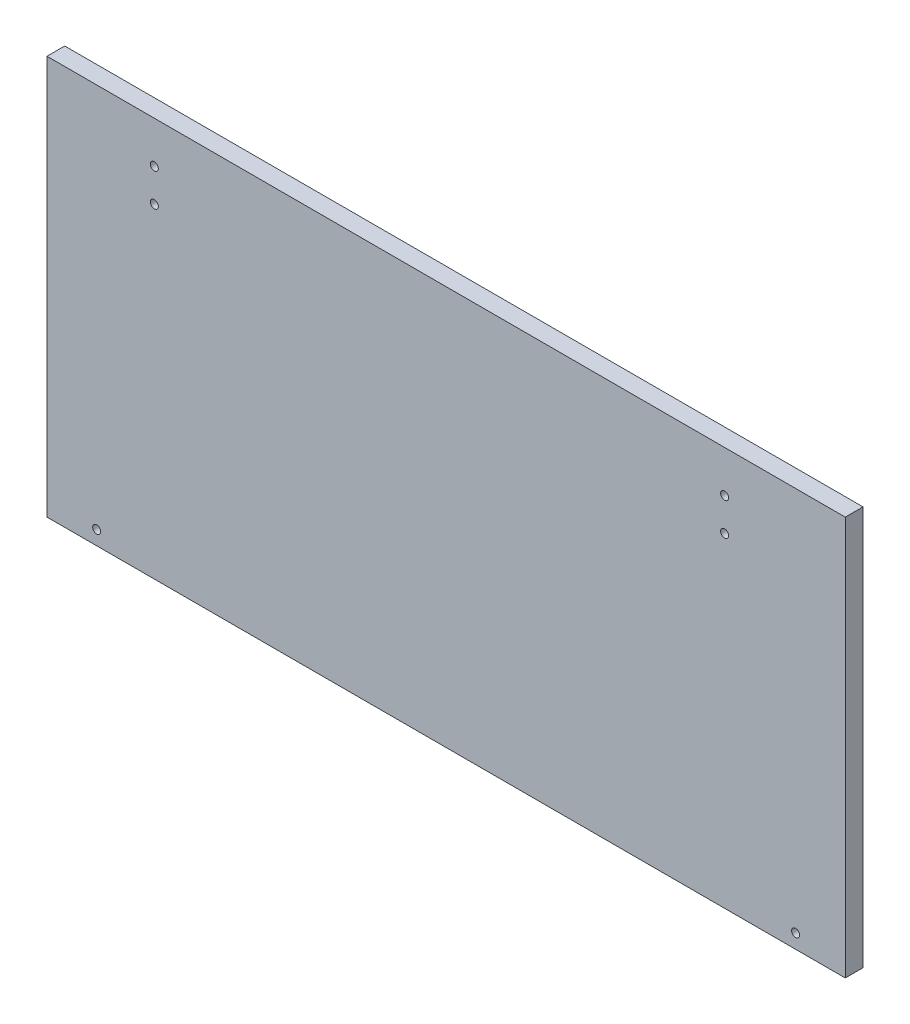
ISO-10303-21;
HEADER;
FILE_DESCRIPTION(('STEP AP214'),'2;1');
FILE_NAME('part.step','',(''),(''),'','','');
FILE_SCHEMA(('AUTOMOTIVE_DESIGN { 1 0 10303 214 1 1 1 1 }'));
ENDSEC;
DATA;
#1=APPLICATION_CONTEXT('core data for automotive mechanical design processes');
#2=APPLICATION_PROTOCOL_DEFINITION('international standard','automotive_design',2000,#1);
#3=PRODUCT_CONTEXT('',#1,'mechanical');
#4=PRODUCT('Part','Part','',(#3));
#5=PRODUCT_RELATED_PRODUCT_CATEGORY('part','',(#4));
#6=PRODUCT_DEFINITION_FORMATION('','',#4);
#7=PRODUCT_DEFINITION_CONTEXT('part definition',#1,'design');
#8=PRODUCT_DEFINITION('design','',#6,#7);
#9=PRODUCT_DEFINITION_SHAPE('','',#8);
#10=(LENGTH_UNIT() NAMED_UNIT(*) SI_UNIT(.MILLI.,.METRE.));
#11=(NAMED_UNIT(*) PLANE_ANGLE_UNIT() SI_UNIT($,.RADIAN.));
#12=(NAMED_UNIT(*) SI_UNIT($,.STERADIAN.) SOLID_ANGLE_UNIT());
#13=UNCERTAINTY_MEASURE_WITH_UNIT(LENGTH_MEASURE(1.E-05),#10,'distance_accuracy_value','');
#14=(GEOMETRIC_REPRESENTATION_CONTEXT(3) GLOBAL_UNCERTAINTY_ASSIGNED_CONTEXT((#13)) GLOBAL_UNIT_ASSIGNED_CONTEXT((#10,
#11,#12)) REPRESENTATION_CONTEXT('',''));
#15=CARTESIAN_POINT('',(0.,0.,0.));
#16=DIRECTION('',(0.,0.,1.));
#17=DIRECTION('',(1.,0.,0.));
#18=AXIS2_PLACEMENT_3D('',#15,#16,#17);
#19=CARTESIAN_POINT('',(-225.,112.5,10.));
#20=DIRECTION('',(1.,0.,0.));
#21=DIRECTION('',(0.,1.,0.));
#22=AXIS2_PLACEMENT_3D('',#19,#20,#21);
#23=PLANE('',#22);
#24=DIRECTION('',(0.,-1.,0.));
#25=VECTOR('',#24,1.);
#26=CARTESIAN_POINT('',(-225.,112.5,0.));
#27=LINE('',#26,#25);
#28=CARTESIAN_POINT('',(-225.,112.5,0.));
#29=VERTEX_POINT('',#28);
#30=CARTESIAN_POINT('',(-225.,-112.5,0.));
#31=VERTEX_POINT('',#30);
#32=EDGE_CURVE('E100',#29,#31,#27,.T.);
#33=ORIENTED_EDGE('',*,*,#32,.T.);
#34=DIRECTION('',(0.,0.,-1.));
#35=VECTOR('',#34,1.);
#36=CARTESIAN_POINT('',(-225.,-112.5,10.));
#37=LINE('',#36,#35);
#38=CARTESIAN_POINT('',(-225.,-112.5,10.));
#39=VERTEX_POINT('',#38);
#40=EDGE_CURVE('E11',#39,#31,#37,.T.);
#41=ORIENTED_EDGE('',*,*,#40,.F.);
#42=DIRECTION('',(0.,-1.,0.));
#43=VECTOR('',#42,1.);
#44=CARTESIAN_POINT('',(-225.,112.5,10.));
#45=LINE('',#44,#43);
#46=CARTESIAN_POINT('',(-225.,112.5,10.));
#47=VERTEX_POINT('',#46);
#48=EDGE_CURVE('E88',#47,#39,#45,.T.);
#49=ORIENTED_EDGE('',*,*,#48,.F.);
#50=DIRECTION('',(0.,0.,-1.));
#51=VECTOR('',#50,1.);
#52=CARTESIAN_POINT('',(-225.,112.5,10.));
#53=LINE('',#52,#51);
#54=EDGE_CURVE('E96',#47,#29,#53,.T.);
#55=ORIENTED_EDGE('',*,*,#54,.T.);
#56=EDGE_LOOP('',(#33,#41,#49,#55));
#57=FACE_BOUND('',#56,.T.);
#58=ADVANCED_FACE('F37',(#57),#23,.F.);
#59=CARTESIAN_POINT('',(-225.,-112.5,10.));
#60=DIRECTION('',(0.,1.,0.));
#61=DIRECTION('',(0.,0.,1.));
#62=AXIS2_PLACEMENT_3D('',#59,#60,#61);
#63=PLANE('',#62);
#64=DIRECTION('',(1.,0.,0.));
#65=VECTOR('',#64,1.);
#66=CARTESIAN_POINT('',(-225.,-112.5,0.));
#67=LINE('',#66,#65);
#68=CARTESIAN_POINT('',(225.,-112.5,0.));
#69=VERTEX_POINT('',#68);
#70=EDGE_CURVE('E92',#31,#69,#67,.T.);
#71=ORIENTED_EDGE('',*,*,#70,.T.);
#72=DIRECTION('',(0.,0.,-1.));
#73=VECTOR('',#72,1.);
#74=CARTESIAN_POINT('',(225.,-112.5,10.));
#75=LINE('',#74,#73);
#76=CARTESIAN_POINT('',(225.,-112.5,10.));
#77=VERTEX_POINT('',#76);
#78=EDGE_CURVE('E45',#77,#69,#75,.T.);
#79=ORIENTED_EDGE('',*,*,#78,.F.);
#80=DIRECTION('',(1.,0.,0.));
#81=VECTOR('',#80,1.);
#82=CARTESIAN_POINT('',(-225.,-112.5,10.));
#83=LINE('',#82,#81);
#84=EDGE_CURVE('E83',#39,#77,#83,.T.);
#85=ORIENTED_EDGE('',*,*,#84,.F.);
#86=ORIENTED_EDGE('',*,*,#40,.T.);
#87=EDGE_LOOP('',(#71,#79,#85,#86));
#88=FACE_BOUND('',#87,.T.);
#89=ADVANCED_FACE('F91',(#88),#63,.F.);
#90=CARTESIAN_POINT('',(225.,112.5,10.));
#91=DIRECTION('',(-1.,0.,0.));
#92=DIRECTION('',(0.,-1.,0.));
#93=AXIS2_PLACEMENT_3D('',#90,#91,#92);
#94=PLANE('',#93);
#95=DIRECTION('',(0.,1.,0.));
#96=VECTOR('',#95,1.);
#97=CARTESIAN_POINT('',(225.,112.5,0.));
#98=LINE('',#97,#96);
#99=CARTESIAN_POINT('',(225.,112.5,0.));
#100=VERTEX_POINT('',#99);
#101=EDGE_CURVE('E70',#69,#100,#98,.T.);
#102=ORIENTED_EDGE('',*,*,#101,.T.);
#103=DIRECTION('',(0.,0.,-1.));
#104=VECTOR('',#103,1.);
#105=CARTESIAN_POINT('',(225.,112.5,10.));
#106=LINE('',#105,#104);
#107=CARTESIAN_POINT('',(225.,112.5,10.));
#108=VERTEX_POINT('',#107);
#109=EDGE_CURVE('E93',#108,#100,#106,.T.);
#110=ORIENTED_EDGE('',*,*,#109,.F.);
#111=DIRECTION('',(0.,1.,0.));
#112=VECTOR('',#111,1.);
#113=CARTESIAN_POINT('',(225.,112.5,10.));
#114=LINE('',#113,#112);
#115=EDGE_CURVE('E86',#77,#108,#114,.T.);
#116=ORIENTED_EDGE('',*,*,#115,.F.);
#117=ORIENTED_EDGE('',*,*,#78,.T.);
#118=EDGE_LOOP('',(#102,#110,#116,#117));
#119=FACE_BOUND('',#118,.T.);
#120=ADVANCED_FACE('F94',(#119),#94,.F.);
#121=CARTESIAN_POINT('',(-225.,112.5,10.));
#122=DIRECTION('',(0.,-1.,0.));
#123=DIRECTION('',(0.,0.,-1.));
#124=AXIS2_PLACEMENT_3D('',#121,#122,#123);
#125=PLANE('',#124);
#126=DIRECTION('',(-1.,0.,0.));
#127=VECTOR('',#126,1.);
#128=CARTESIAN_POINT('',(-225.,112.5,0.));
#129=LINE('',#128,#127);
#130=EDGE_CURVE('E76',#100,#29,#129,.T.);
#131=ORIENTED_EDGE('',*,*,#130,.T.);
#132=ORIENTED_EDGE('',*,*,#54,.F.);
#133=DIRECTION('',(-1.,0.,0.));
#134=VECTOR('',#133,1.);
#135=CARTESIAN_POINT('',(-225.,112.5,10.));
#136=LINE('',#135,#134);
#137=EDGE_CURVE('E53',#108,#47,#136,.T.);
#138=ORIENTED_EDGE('',*,*,#137,.F.);
#139=ORIENTED_EDGE('',*,*,#109,.T.);
#140=EDGE_LOOP('',(#131,#132,#138,#139));
#141=FACE_BOUND('',#140,.T.);
#142=ADVANCED_FACE('F108',(#141),#125,.F.);
#143=CARTESIAN_POINT('',(0.,0.,10.));
#144=DIRECTION('',(0.,0.,1.));
#145=DIRECTION('',(1.,0.,0.));
#146=AXIS2_PLACEMENT_3D('',#143,#144,#145);
#147=PLANE('',#146);
#148=CARTESIAN_POINT('',(-197.,-104.5,10.));
#149=DIRECTION('',(0.,0.,-1.));
#150=DIRECTION('',(-1.,0.,0.));
#151=AXIS2_PLACEMENT_3D('',#148,#149,#150);
#152=CIRCLE('',#151,2.25000000000001);
#153=CARTESIAN_POINT('',(-199.25,-104.5,10.));
#154=VERTEX_POINT('',#153);
#155=EDGE_CURVE('E135',#154,#154,#152,.T.);
#156=ORIENTED_EDGE('',*,*,#155,.T.);
#157=EDGE_LOOP('',(#156));
#158=FACE_BOUND('',#157,.T.);
#159=CARTESIAN_POINT('',(197.,-104.5,10.));
#160=DIRECTION('',(0.,0.,-1.));
#161=DIRECTION('',(-1.,0.,0.));
#162=AXIS2_PLACEMENT_3D('',#159,#160,#161);
#163=CIRCLE('',#162,2.25000000000001);
#164=CARTESIAN_POINT('',(194.75,-104.5,10.));
#165=VERTEX_POINT('',#164);
#166=EDGE_CURVE('E138',#165,#165,#163,.T.);
#167=ORIENTED_EDGE('',*,*,#166,.T.);
#168=EDGE_LOOP('',(#167));
#169=FACE_BOUND('',#168,.T.);
#170=CARTESIAN_POINT('',(157.,70.5,10.));
#171=DIRECTION('',(0.,0.,-1.));
#172=DIRECTION('',(-1.,0.,0.));
#173=AXIS2_PLACEMENT_3D('',#170,#171,#172);
#174=CIRCLE('',#173,2.25000000000001);
#175=CARTESIAN_POINT('',(154.75,70.5,10.));
#176=VERTEX_POINT('',#175);
#177=EDGE_CURVE('E127',#176,#176,#174,.T.);
#178=ORIENTED_EDGE('',*,*,#177,.T.);
#179=EDGE_LOOP('',(#178));
#180=FACE_BOUND('',#179,.T.);
#181=CARTESIAN_POINT('',(-164.5,89.,10.));
#182=DIRECTION('',(0.,0.,-1.));
#183=DIRECTION('',(-1.,0.,0.));
#184=AXIS2_PLACEMENT_3D('',#181,#182,#183);
#185=CIRCLE('',#184,2.25000000000001);
#186=CARTESIAN_POINT('',(-166.75,89.,10.));
#187=VERTEX_POINT('',#186);
#188=EDGE_CURVE('E120',#187,#187,#185,.T.);
#189=ORIENTED_EDGE('',*,*,#188,.T.);
#190=EDGE_LOOP('',(#189));
#191=FACE_BOUND('',#190,.T.);
#192=CARTESIAN_POINT('',(-164.5,70.5,10.));
#193=DIRECTION('',(0.,0.,-1.));
#194=DIRECTION('',(-1.,0.,0.));
#195=AXIS2_PLACEMENT_3D('',#192,#193,#194);
#196=CIRCLE('',#195,2.25000000000001);
#197=CARTESIAN_POINT('',(-166.75,70.5,10.));
#198=VERTEX_POINT('',#197);
#199=EDGE_CURVE('E132',#198,#198,#196,.T.);
#200=ORIENTED_EDGE('',*,*,#199,.T.);
#201=EDGE_LOOP('',(#200));
#202=FACE_BOUND('',#201,.T.);
#203=CARTESIAN_POINT('',(157.,89.,10.));
#204=DIRECTION('',(0.,0.,-1.));
#205=DIRECTION('',(-1.,0.,0.));
#206=AXIS2_PLACEMENT_3D('',#203,#204,#205);
#207=CIRCLE('',#206,2.25000000000001);
#208=CARTESIAN_POINT('',(154.75,89.,10.));
#209=VERTEX_POINT('',#208);
#210=EDGE_CURVE('E103',#209,#209,#207,.T.);
#211=ORIENTED_EDGE('',*,*,#210,.T.);
#212=EDGE_LOOP('',(#211));
#213=FACE_BOUND('',#212,.T.);
#214=ORIENTED_EDGE('',*,*,#48,.T.);
#215=ORIENTED_EDGE('',*,*,#84,.T.);
#216=ORIENTED_EDGE('',*,*,#115,.T.);
#217=ORIENTED_EDGE('',*,*,#137,.T.);
#218=EDGE_LOOP('',(#214,#215,#216,#217));
#219=FACE_BOUND('',#218,.T.);
#220=ADVANCED_FACE('F84',(#158,#169,#180,#191,#202,#213,#219),#147,.T.);
#221=CARTESIAN_POINT('',(0.,0.,0.));
#222=DIRECTION('',(0.,0.,1.));
#223=DIRECTION('',(1.,0.,0.));
#224=AXIS2_PLACEMENT_3D('',#221,#222,#223);
#225=PLANE('',#224);
#226=CARTESIAN_POINT('',(-197.,-104.5,0.));
#227=DIRECTION('',(0.,0.,-1.));
#228=DIRECTION('',(-1.,0.,0.));
#229=AXIS2_PLACEMENT_3D('',#226,#227,#228);
#230=CIRCLE('',#229,2.25000000000001);
#231=CARTESIAN_POINT('',(-199.25,-104.5,0.));
#232=VERTEX_POINT('',#231);
#233=EDGE_CURVE('E144',#232,#232,#230,.T.);
#234=ORIENTED_EDGE('',*,*,#233,.F.);
#235=EDGE_LOOP('',(#234));
#236=FACE_BOUND('',#235,.T.);
#237=CARTESIAN_POINT('',(197.,-104.5,0.));
#238=DIRECTION('',(0.,0.,-1.));
#239=DIRECTION('',(-1.,0.,0.));
#240=AXIS2_PLACEMENT_3D('',#237,#238,#239);
#241=CIRCLE('',#240,2.25000000000001);
#242=CARTESIAN_POINT('',(194.75,-104.5,0.));
#243=VERTEX_POINT('',#242);
#244=EDGE_CURVE('E141',#243,#243,#241,.T.);
#245=ORIENTED_EDGE('',*,*,#244,.F.);
#246=EDGE_LOOP('',(#245));
#247=FACE_BOUND('',#246,.T.);
#248=CARTESIAN_POINT('',(157.,70.5,0.));
#249=DIRECTION('',(0.,0.,-1.));
#250=DIRECTION('',(-1.,0.,0.));
#251=AXIS2_PLACEMENT_3D('',#248,#249,#250);
#252=CIRCLE('',#251,2.25000000000001);
#253=CARTESIAN_POINT('',(154.75,70.5,0.));
#254=VERTEX_POINT('',#253);
#255=EDGE_CURVE('E117',#254,#254,#252,.T.);
#256=ORIENTED_EDGE('',*,*,#255,.F.);
#257=EDGE_LOOP('',(#256));
#258=FACE_BOUND('',#257,.T.);
#259=CARTESIAN_POINT('',(-164.5,89.,0.));
#260=DIRECTION('',(0.,0.,-1.));
#261=DIRECTION('',(-1.,0.,0.));
#262=AXIS2_PLACEMENT_3D('',#259,#260,#261);
#263=CIRCLE('',#262,2.25000000000001);
#264=CARTESIAN_POINT('',(-166.75,89.,0.));
#265=VERTEX_POINT('',#264);
#266=EDGE_CURVE('E123',#265,#265,#263,.T.);
#267=ORIENTED_EDGE('',*,*,#266,.F.);
#268=EDGE_LOOP('',(#267));
#269=FACE_BOUND('',#268,.T.);
#270=CARTESIAN_POINT('',(-164.5,70.5,0.));
#271=DIRECTION('',(0.,0.,-1.));
#272=DIRECTION('',(-1.,0.,0.));
#273=AXIS2_PLACEMENT_3D('',#270,#271,#272);
#274=CIRCLE('',#273,2.25000000000001);
#275=CARTESIAN_POINT('',(-166.75,70.5,0.));
#276=VERTEX_POINT('',#275);
#277=EDGE_CURVE('E124',#276,#276,#274,.T.);
#278=ORIENTED_EDGE('',*,*,#277,.F.);
#279=EDGE_LOOP('',(#278));
#280=FACE_BOUND('',#279,.T.);
#281=CARTESIAN_POINT('',(157.,89.,0.));
#282=DIRECTION('',(0.,0.,-1.));
#283=DIRECTION('',(-1.,0.,0.));
#284=AXIS2_PLACEMENT_3D('',#281,#282,#283);
#285=CIRCLE('',#284,2.25000000000001);
#286=CARTESIAN_POINT('',(154.75,89.,0.));
#287=VERTEX_POINT('',#286);
#288=EDGE_CURVE('E114',#287,#287,#285,.T.);
#289=ORIENTED_EDGE('',*,*,#288,.F.);
#290=EDGE_LOOP('',(#289));
#291=FACE_BOUND('',#290,.T.);
#292=ORIENTED_EDGE('',*,*,#32,.F.);
#293=ORIENTED_EDGE('',*,*,#130,.F.);
#294=ORIENTED_EDGE('',*,*,#101,.F.);
#295=ORIENTED_EDGE('',*,*,#70,.F.);
#296=EDGE_LOOP('',(#292,#293,#294,#295));
#297=FACE_BOUND('',#296,.T.);
#298=ADVANCED_FACE('F111',(#236,#247,#258,#269,#280,#291,#297),#225,.F.);
#299=CARTESIAN_POINT('',(157.,89.,10.));
#300=DIRECTION('',(0.,0.,-1.));
#301=DIRECTION('',(-1.,0.,0.));
#302=AXIS2_PLACEMENT_3D('',#299,#300,#301);
#303=CYLINDRICAL_SURFACE('',#302,2.25000000000001);
#304=ORIENTED_EDGE('',*,*,#210,.F.);
#305=EDGE_LOOP('',(#304));
#306=FACE_BOUND('',#305,.T.);
#307=ORIENTED_EDGE('',*,*,#288,.T.);
#308=EDGE_LOOP('',(#307));
#309=FACE_BOUND('',#308,.T.);
#310=ADVANCED_FACE('F161',(#306,#309),#303,.F.);
#311=CARTESIAN_POINT('',(-164.5,70.5,10.));
#312=DIRECTION('',(0.,0.,-1.));
#313=DIRECTION('',(-1.,0.,0.));
#314=AXIS2_PLACEMENT_3D('',#311,#312,#313);
#315=CYLINDRICAL_SURFACE('',#314,2.25000000000001);
#316=ORIENTED_EDGE('',*,*,#199,.F.);
#317=EDGE_LOOP('',(#316));
#318=FACE_BOUND('',#317,.T.);
#319=ORIENTED_EDGE('',*,*,#277,.T.);
#320=EDGE_LOOP('',(#319));
#321=FACE_BOUND('',#320,.T.);
#322=ADVANCED_FACE('F174',(#318,#321),#315,.F.);
#323=CARTESIAN_POINT('',(-164.5,89.,10.));
#324=DIRECTION('',(0.,0.,-1.));
#325=DIRECTION('',(-1.,0.,0.));
#326=AXIS2_PLACEMENT_3D('',#323,#324,#325);
#327=CYLINDRICAL_SURFACE('',#326,2.25000000000001);
#328=ORIENTED_EDGE('',*,*,#188,.F.);
#329=EDGE_LOOP('',(#328));
#330=FACE_BOUND('',#329,.T.);
#331=ORIENTED_EDGE('',*,*,#266,.T.);
#332=EDGE_LOOP('',(#331));
#333=FACE_BOUND('',#332,.T.);
#334=ADVANCED_FACE('F180',(#330,#333),#327,.F.);
#335=CARTESIAN_POINT('',(157.,70.5,10.));
#336=DIRECTION('',(0.,0.,-1.));
#337=DIRECTION('',(-1.,0.,0.));
#338=AXIS2_PLACEMENT_3D('',#335,#336,#337);
#339=CYLINDRICAL_SURFACE('',#338,2.25000000000001);
#340=ORIENTED_EDGE('',*,*,#177,.F.);
#341=EDGE_LOOP('',(#340));
#342=FACE_BOUND('',#341,.T.);
#343=ORIENTED_EDGE('',*,*,#255,.T.);
#344=EDGE_LOOP('',(#343));
#345=FACE_BOUND('',#344,.T.);
#346=ADVANCED_FACE('F217',(#342,#345),#339,.F.);
#347=CARTESIAN_POINT('',(197.,-104.5,10.));
#348=DIRECTION('',(0.,0.,-1.));
#349=DIRECTION('',(-1.,0.,0.));
#350=AXIS2_PLACEMENT_3D('',#347,#348,#349);
#351=CYLINDRICAL_SURFACE('',#350,2.25000000000001);
#352=ORIENTED_EDGE('',*,*,#166,.F.);
#353=EDGE_LOOP('',(#352));
#354=FACE_BOUND('',#353,.T.);
#355=ORIENTED_EDGE('',*,*,#244,.T.);
#356=EDGE_LOOP('',(#355));
#357=FACE_BOUND('',#356,.T.);
#358=ADVANCED_FACE('F155',(#354,#357),#351,.F.);
#359=CARTESIAN_POINT('',(-197.,-104.5,10.));
#360=DIRECTION('',(0.,0.,-1.));
#361=DIRECTION('',(-1.,0.,0.));
#362=AXIS2_PLACEMENT_3D('',#359,#360,#361);
#363=CYLINDRICAL_SURFACE('',#362,2.25000000000001);
#364=ORIENTED_EDGE('',*,*,#155,.F.);
#365=EDGE_LOOP('',(#364));
#366=FACE_BOUND('',#365,.T.);
#367=ORIENTED_EDGE('',*,*,#233,.T.);
#368=EDGE_LOOP('',(#367));
#369=FACE_BOUND('',#368,.T.);
#370=ADVANCED_FACE('F152',(#366,#369),#363,.F.);
#371=CLOSED_SHELL('',(#58,#89,#120,#142,#220,#298,#310,#322,#334,#346,#358,#370));
#372=MANIFOLD_SOLID_BREP('B2',#371);
#373=ADVANCED_BREP_SHAPE_REPRESENTATION('',(#18,#372),#14);
#374=SHAPE_DEFINITION_REPRESENTATION(#9,#373);
ENDSEC;
END-ISO-10303-21;
